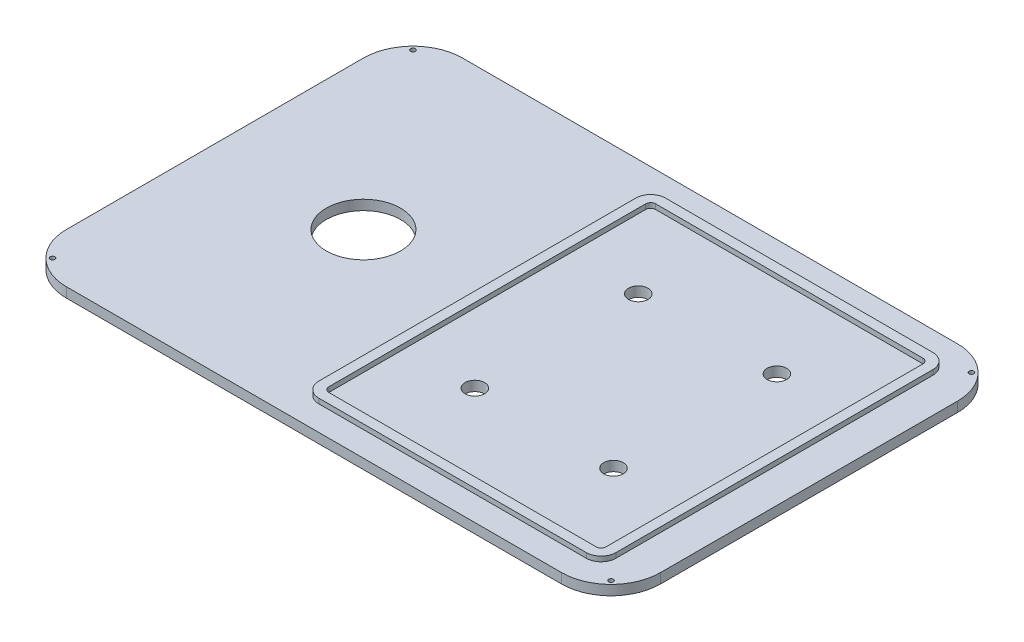
ISO-10303-21;
HEADER;
FILE_DESCRIPTION(('STEP AP214'),'2;1');
FILE_NAME('part.step','',(''),(''),'','','');
FILE_SCHEMA(('AUTOMOTIVE_DESIGN { 1 0 10303 214 1 1 1 1 }'));
ENDSEC;
DATA;
#1=APPLICATION_CONTEXT('core data for automotive mechanical design processes');
#2=APPLICATION_PROTOCOL_DEFINITION('international standard','automotive_design',2000,#1);
#3=PRODUCT_CONTEXT('',#1,'mechanical');
#4=PRODUCT('Part','Part','',(#3));
#5=PRODUCT_RELATED_PRODUCT_CATEGORY('part','',(#4));
#6=PRODUCT_DEFINITION_FORMATION('','',#4);
#7=PRODUCT_DEFINITION_CONTEXT('part definition',#1,'design');
#8=PRODUCT_DEFINITION('design','',#6,#7);
#9=PRODUCT_DEFINITION_SHAPE('','',#8);
#10=(LENGTH_UNIT() NAMED_UNIT(*) SI_UNIT(.MILLI.,.METRE.));
#11=(NAMED_UNIT(*) PLANE_ANGLE_UNIT() SI_UNIT($,.RADIAN.));
#12=(NAMED_UNIT(*) SI_UNIT($,.STERADIAN.) SOLID_ANGLE_UNIT());
#13=UNCERTAINTY_MEASURE_WITH_UNIT(LENGTH_MEASURE(1.E-05),#10,'distance_accuracy_value','');
#14=(GEOMETRIC_REPRESENTATION_CONTEXT(3) GLOBAL_UNCERTAINTY_ASSIGNED_CONTEXT((#13)) GLOBAL_UNIT_ASSIGNED_CONTEXT((#10,
#11,#12)) REPRESENTATION_CONTEXT('',''));
#15=CARTESIAN_POINT('',(0.,0.,0.));
#16=DIRECTION('',(0.,0.,1.));
#17=DIRECTION('',(1.,0.,0.));
#18=AXIS2_PLACEMENT_3D('',#15,#16,#17);
#19=CARTESIAN_POINT('',(63.5,2.54,-38.1));
#20=DIRECTION('',(0.,1.,0.));
#21=DIRECTION('',(0.,0.,1.));
#22=AXIS2_PLACEMENT_3D('',#19,#20,#21);
#23=PLANE('',#22);
#24=CARTESIAN_POINT('',(-38.1,2.54,0.));
#25=DIRECTION('',(0.,1.,0.));
#26=DIRECTION('',(0.,0.,1.));
#27=AXIS2_PLACEMENT_3D('',#24,#25,#26);
#28=CIRCLE('',#27,9.525);
#29=CARTESIAN_POINT('',(-38.1,2.54,9.52500000000001));
#30=VERTEX_POINT('',#29);
#31=EDGE_CURVE('E883',#30,#30,#28,.T.);
#32=ORIENTED_EDGE('',*,*,#31,.F.);
#33=EDGE_LOOP('',(#32));
#34=FACE_BOUND('',#33,.T.);
#35=CARTESIAN_POINT('',(71.628,2.54,-46.228));
#36=DIRECTION('',(0.,1.,0.));
#37=DIRECTION('',(0.,0.,1.));
#38=AXIS2_PLACEMENT_3D('',#35,#36,#37);
#39=CIRCLE('',#38,0.600000000000008);
#40=CARTESIAN_POINT('',(71.628,2.54,-45.628));
#41=VERTEX_POINT('',#40);
#42=EDGE_CURVE('E404',#41,#41,#39,.T.);
#43=ORIENTED_EDGE('',*,*,#42,.F.);
#44=EDGE_LOOP('',(#43));
#45=FACE_BOUND('',#44,.T.);
#46=CARTESIAN_POINT('',(71.628,2.54,46.228));
#47=DIRECTION('',(0.,1.,0.));
#48=DIRECTION('',(0.,0.,1.));
#49=AXIS2_PLACEMENT_3D('',#46,#47,#48);
#50=CIRCLE('',#49,0.600000000000008);
#51=CARTESIAN_POINT('',(71.628,2.54,46.828));
#52=VERTEX_POINT('',#51);
#53=EDGE_CURVE('E396',#52,#52,#50,.T.);
#54=ORIENTED_EDGE('',*,*,#53,.F.);
#55=EDGE_LOOP('',(#54));
#56=FACE_BOUND('',#55,.T.);
#57=CARTESIAN_POINT('',(-71.628,2.54,46.228));
#58=DIRECTION('',(0.,1.,0.));
#59=DIRECTION('',(0.,0.,1.));
#60=AXIS2_PLACEMENT_3D('',#57,#58,#59);
#61=CIRCLE('',#60,0.600000000000008);
#62=CARTESIAN_POINT('',(-71.628,2.54,46.828));
#63=VERTEX_POINT('',#62);
#64=EDGE_CURVE('E387',#63,#63,#61,.T.);
#65=ORIENTED_EDGE('',*,*,#64,.F.);
#66=EDGE_LOOP('',(#65));
#67=FACE_BOUND('',#66,.T.);
#68=CARTESIAN_POINT('',(-71.628,2.54,-46.228));
#69=DIRECTION('',(0.,1.,0.));
#70=DIRECTION('',(0.,0.,1.));
#71=AXIS2_PLACEMENT_3D('',#68,#69,#70);
#72=CIRCLE('',#71,0.600000000000008);
#73=CARTESIAN_POINT('',(-71.628,2.54,-45.628));
#74=VERTEX_POINT('',#73);
#75=EDGE_CURVE('E391',#74,#74,#72,.T.);
#76=ORIENTED_EDGE('',*,*,#75,.F.);
#77=EDGE_LOOP('',(#76));
#78=FACE_BOUND('',#77,.T.);
#79=CARTESIAN_POINT('',(63.5,2.54,-38.1));
#80=DIRECTION('',(0.,1.,0.));
#81=DIRECTION('',(0.,0.,1.));
#82=AXIS2_PLACEMENT_3D('',#79,#80,#81);
#83=CIRCLE('',#82,12.7);
#84=CARTESIAN_POINT('',(76.2,2.54,-38.0999999999999));
#85=VERTEX_POINT('',#84);
#86=CARTESIAN_POINT('',(63.4999999999999,2.54,-50.8));
#87=VERTEX_POINT('',#86);
#88=EDGE_CURVE('E419',#85,#87,#83,.T.);
#89=ORIENTED_EDGE('',*,*,#88,.T.);
#90=DIRECTION('',(-1.,0.,0.));
#91=VECTOR('',#90,1.);
#92=CARTESIAN_POINT('',(63.4999999999999,2.54,-50.8));
#93=LINE('',#92,#91);
#94=CARTESIAN_POINT('',(-63.5,2.54,-50.8));
#95=VERTEX_POINT('',#94);
#96=EDGE_CURVE('E423',#87,#95,#93,.T.);
#97=ORIENTED_EDGE('',*,*,#96,.T.);
#98=CARTESIAN_POINT('',(-63.5,2.54,-38.1));
#99=DIRECTION('',(0.,1.,0.));
#100=DIRECTION('',(0.,0.,-1.));
#101=AXIS2_PLACEMENT_3D('',#98,#99,#100);
#102=CIRCLE('',#101,12.7);
#103=CARTESIAN_POINT('',(-76.2,2.54,-38.0999999999999));
#104=VERTEX_POINT('',#103);
#105=EDGE_CURVE('E427',#95,#104,#102,.T.);
#106=ORIENTED_EDGE('',*,*,#105,.T.);
#107=DIRECTION('',(0.,0.,1.));
#108=VECTOR('',#107,1.);
#109=CARTESIAN_POINT('',(-76.2,2.54,-38.0999999999999));
#110=LINE('',#109,#108);
#111=CARTESIAN_POINT('',(-76.2,2.54,38.0999999999999));
#112=VERTEX_POINT('',#111);
#113=EDGE_CURVE('E430',#104,#112,#110,.T.);
#114=ORIENTED_EDGE('',*,*,#113,.T.);
#115=CARTESIAN_POINT('',(-63.5,2.54,38.1));
#116=DIRECTION('',(0.,1.,0.));
#117=DIRECTION('',(0.,0.,1.));
#118=AXIS2_PLACEMENT_3D('',#115,#116,#117);
#119=CIRCLE('',#118,12.7);
#120=CARTESIAN_POINT('',(-63.4999999999999,2.54,50.8));
#121=VERTEX_POINT('',#120);
#122=EDGE_CURVE('E433',#112,#121,#119,.T.);
#123=ORIENTED_EDGE('',*,*,#122,.T.);
#124=DIRECTION('',(1.,0.,0.));
#125=VECTOR('',#124,1.);
#126=CARTESIAN_POINT('',(63.4999999999999,2.54,50.8));
#127=LINE('',#126,#125);
#128=CARTESIAN_POINT('',(63.4999999999999,2.54,50.8));
#129=VERTEX_POINT('',#128);
#130=EDGE_CURVE('E436',#121,#129,#127,.T.);
#131=ORIENTED_EDGE('',*,*,#130,.T.);
#132=CARTESIAN_POINT('',(63.5,2.54,38.1));
#133=DIRECTION('',(0.,1.,0.));
#134=DIRECTION('',(0.,0.,1.));
#135=AXIS2_PLACEMENT_3D('',#132,#133,#134);
#136=CIRCLE('',#135,12.7);
#137=CARTESIAN_POINT('',(76.2,2.54,38.0999999999999));
#138=VERTEX_POINT('',#137);
#139=EDGE_CURVE('E439',#129,#138,#136,.T.);
#140=ORIENTED_EDGE('',*,*,#139,.T.);
#141=DIRECTION('',(0.,0.,-1.));
#142=VECTOR('',#141,1.);
#143=CARTESIAN_POINT('',(76.2,2.54,-38.0999999999999));
#144=LINE('',#143,#142);
#145=EDGE_CURVE('E442',#138,#85,#144,.T.);
#146=ORIENTED_EDGE('',*,*,#145,.T.);
#147=EDGE_LOOP('',(#89,#97,#106,#114,#123,#131,#140,#146));
#148=FACE_BOUND('',#147,.T.);
#149=DIRECTION('',(1.,0.,0.));
#150=VECTOR('',#149,1.);
#151=CARTESIAN_POINT('',(63.5,2.54,44.45));
#152=LINE('',#151,#150);
#153=CARTESIAN_POINT('',(-5.07999999999996,2.54,44.45));
#154=VERTEX_POINT('',#153);
#155=CARTESIAN_POINT('',(63.5,2.54,44.45));
#156=VERTEX_POINT('',#155);
#157=EDGE_CURVE('E338',#154,#156,#152,.T.);
#158=ORIENTED_EDGE('',*,*,#157,.F.);
#159=CARTESIAN_POINT('',(-5.07999999999999,2.54,40.64));
#160=DIRECTION('',(0.,1.,0.));
#161=DIRECTION('',(0.,0.,-1.));
#162=AXIS2_PLACEMENT_3D('',#159,#160,#161);
#163=CIRCLE('',#162,3.81);
#164=CARTESIAN_POINT('',(-8.88999999999998,2.54,40.64));
#165=VERTEX_POINT('',#164);
#166=EDGE_CURVE('E290',#165,#154,#163,.T.);
#167=ORIENTED_EDGE('',*,*,#166,.F.);
#168=DIRECTION('',(0.,0.,1.));
#169=VECTOR('',#168,1.);
#170=CARTESIAN_POINT('',(-8.89,2.54,-40.64));
#171=LINE('',#170,#169);
#172=CARTESIAN_POINT('',(-8.89,2.54,-40.64));
#173=VERTEX_POINT('',#172);
#174=EDGE_CURVE('E313',#173,#165,#171,.T.);
#175=ORIENTED_EDGE('',*,*,#174,.F.);
#176=CARTESIAN_POINT('',(-5.08,2.54,-40.64));
#177=DIRECTION('',(0.,1.,0.));
#178=DIRECTION('',(0.,0.,-1.));
#179=AXIS2_PLACEMENT_3D('',#176,#177,#178);
#180=CIRCLE('',#179,3.81);
#181=CARTESIAN_POINT('',(-5.07999999999997,2.54,-44.45));
#182=VERTEX_POINT('',#181);
#183=EDGE_CURVE('E353',#182,#173,#180,.T.);
#184=ORIENTED_EDGE('',*,*,#183,.F.);
#185=DIRECTION('',(-1.,0.,0.));
#186=VECTOR('',#185,1.);
#187=CARTESIAN_POINT('',(63.5,2.54,-44.45));
#188=LINE('',#187,#186);
#189=CARTESIAN_POINT('',(63.5,2.54,-44.45));
#190=VERTEX_POINT('',#189);
#191=EDGE_CURVE('E350',#190,#182,#188,.T.);
#192=ORIENTED_EDGE('',*,*,#191,.F.);
#193=CARTESIAN_POINT('',(63.5,2.54,-40.64));
#194=DIRECTION('',(0.,1.,0.));
#195=DIRECTION('',(0.,0.,-1.));
#196=AXIS2_PLACEMENT_3D('',#193,#194,#195);
#197=CIRCLE('',#196,3.81);
#198=CARTESIAN_POINT('',(67.31,2.54,-40.64));
#199=VERTEX_POINT('',#198);
#200=EDGE_CURVE('E347',#199,#190,#197,.T.);
#201=ORIENTED_EDGE('',*,*,#200,.F.);
#202=DIRECTION('',(0.,0.,-1.));
#203=VECTOR('',#202,1.);
#204=CARTESIAN_POINT('',(67.31,2.54,-40.64));
#205=LINE('',#204,#203);
#206=CARTESIAN_POINT('',(67.31,2.54,40.64));
#207=VERTEX_POINT('',#206);
#208=EDGE_CURVE('E344',#207,#199,#205,.T.);
#209=ORIENTED_EDGE('',*,*,#208,.F.);
#210=CARTESIAN_POINT('',(63.5,2.54,40.64));
#211=DIRECTION('',(0.,1.,0.));
#212=DIRECTION('',(0.,0.,-1.));
#213=AXIS2_PLACEMENT_3D('',#210,#211,#212);
#214=CIRCLE('',#213,3.81);
#215=EDGE_CURVE('E341',#156,#207,#214,.T.);
#216=ORIENTED_EDGE('',*,*,#215,.F.);
#217=EDGE_LOOP('',(#158,#167,#175,#184,#192,#201,#209,#216));
#218=FACE_BOUND('',#217,.T.);
#219=ADVANCED_FACE('F45',(#34,#45,#56,#67,#78,#148,#218),#23,.T.);
#220=CARTESIAN_POINT('',(63.5,2.54,-38.1));
#221=DIRECTION('',(0.,-1.,0.));
#222=DIRECTION('',(0.,0.,-1.));
#223=AXIS2_PLACEMENT_3D('',#220,#221,#222);
#224=CYLINDRICAL_SURFACE('',#223,12.7);
#225=CARTESIAN_POINT('',(63.5,0.,-38.1));
#226=DIRECTION('',(0.,1.,0.));
#227=DIRECTION('',(0.,0.,1.));
#228=AXIS2_PLACEMENT_3D('',#225,#226,#227);
#229=CIRCLE('',#228,12.7);
#230=CARTESIAN_POINT('',(76.2,0.,-38.0999999999999));
#231=VERTEX_POINT('',#230);
#232=CARTESIAN_POINT('',(63.4999999999999,0.,-50.8));
#233=VERTEX_POINT('',#232);
#234=EDGE_CURVE('E415',#231,#233,#229,.T.);
#235=ORIENTED_EDGE('',*,*,#234,.T.);
#236=DIRECTION('',(0.,-1.,0.));
#237=VECTOR('',#236,1.);
#238=CARTESIAN_POINT('',(63.4999999999999,2.54,-50.8));
#239=LINE('',#238,#237);
#240=EDGE_CURVE('E11',#87,#233,#239,.T.);
#241=ORIENTED_EDGE('',*,*,#240,.F.);
#242=ORIENTED_EDGE('',*,*,#88,.F.);
#243=DIRECTION('',(0.,-1.,0.));
#244=VECTOR('',#243,1.);
#245=CARTESIAN_POINT('',(76.2,2.54,-38.0999999999999));
#246=LINE('',#245,#244);
#247=EDGE_CURVE('E445',#85,#231,#246,.T.);
#248=ORIENTED_EDGE('',*,*,#247,.T.);
#249=EDGE_LOOP('',(#235,#241,#242,#248));
#250=FACE_BOUND('',#249,.T.);
#251=ADVANCED_FACE('F47',(#250),#224,.T.);
#252=CARTESIAN_POINT('',(63.4999999999999,2.54,-50.8));
#253=DIRECTION('',(0.,0.,1.));
#254=DIRECTION('',(1.,0.,0.));
#255=AXIS2_PLACEMENT_3D('',#252,#253,#254);
#256=PLANE('',#255);
#257=DIRECTION('',(-1.,0.,0.));
#258=VECTOR('',#257,1.);
#259=CARTESIAN_POINT('',(63.4999999999999,0.,-50.8));
#260=LINE('',#259,#258);
#261=CARTESIAN_POINT('',(-63.5,0.,-50.8));
#262=VERTEX_POINT('',#261);
#263=EDGE_CURVE('E449',#233,#262,#260,.T.);
#264=ORIENTED_EDGE('',*,*,#263,.T.);
#265=DIRECTION('',(0.,-1.,0.));
#266=VECTOR('',#265,1.);
#267=CARTESIAN_POINT('',(-63.5,2.54,-50.8));
#268=LINE('',#267,#266);
#269=EDGE_CURVE('E55',#95,#262,#268,.T.);
#270=ORIENTED_EDGE('',*,*,#269,.F.);
#271=ORIENTED_EDGE('',*,*,#96,.F.);
#272=ORIENTED_EDGE('',*,*,#240,.T.);
#273=EDGE_LOOP('',(#264,#270,#271,#272));
#274=FACE_BOUND('',#273,.T.);
#275=ADVANCED_FACE('F521',(#274),#256,.F.);
#276=CARTESIAN_POINT('',(-63.5,2.54,-38.1));
#277=DIRECTION('',(0.,-1.,0.));
#278=DIRECTION('',(0.,0.,-1.));
#279=AXIS2_PLACEMENT_3D('',#276,#277,#278);
#280=CYLINDRICAL_SURFACE('',#279,12.7);
#281=CARTESIAN_POINT('',(-63.5,0.,-38.1));
#282=DIRECTION('',(0.,1.,0.));
#283=DIRECTION('',(0.,0.,-1.));
#284=AXIS2_PLACEMENT_3D('',#281,#282,#283);
#285=CIRCLE('',#284,12.7);
#286=CARTESIAN_POINT('',(-76.2,0.,-38.0999999999999));
#287=VERTEX_POINT('',#286);
#288=EDGE_CURVE('E452',#262,#287,#285,.T.);
#289=ORIENTED_EDGE('',*,*,#288,.T.);
#290=DIRECTION('',(0.,-1.,0.));
#291=VECTOR('',#290,1.);
#292=CARTESIAN_POINT('',(-76.2,2.54,-38.0999999999999));
#293=LINE('',#292,#291);
#294=EDGE_CURVE('E488',#104,#287,#293,.T.);
#295=ORIENTED_EDGE('',*,*,#294,.F.);
#296=ORIENTED_EDGE('',*,*,#105,.F.);
#297=ORIENTED_EDGE('',*,*,#269,.T.);
#298=EDGE_LOOP('',(#289,#295,#296,#297));
#299=FACE_BOUND('',#298,.T.);
#300=ADVANCED_FACE('F498',(#299),#280,.T.);
#301=CARTESIAN_POINT('',(-76.2,2.54,-38.0999999999999));
#302=DIRECTION('',(1.,0.,0.));
#303=DIRECTION('',(0.,0.,-1.));
#304=AXIS2_PLACEMENT_3D('',#301,#302,#303);
#305=PLANE('',#304);
#306=DIRECTION('',(0.,0.,1.));
#307=VECTOR('',#306,1.);
#308=CARTESIAN_POINT('',(-76.2,0.,-38.0999999999999));
#309=LINE('',#308,#307);
#310=CARTESIAN_POINT('',(-76.2,0.,38.0999999999999));
#311=VERTEX_POINT('',#310);
#312=EDGE_CURVE('E455',#287,#311,#309,.T.);
#313=ORIENTED_EDGE('',*,*,#312,.T.);
#314=DIRECTION('',(0.,-1.,0.));
#315=VECTOR('',#314,1.);
#316=CARTESIAN_POINT('',(-76.2,2.54,38.0999999999999));
#317=LINE('',#316,#315);
#318=EDGE_CURVE('E484',#112,#311,#317,.T.);
#319=ORIENTED_EDGE('',*,*,#318,.F.);
#320=ORIENTED_EDGE('',*,*,#113,.F.);
#321=ORIENTED_EDGE('',*,*,#294,.T.);
#322=EDGE_LOOP('',(#313,#319,#320,#321));
#323=FACE_BOUND('',#322,.T.);
#324=ADVANCED_FACE('F509',(#323),#305,.F.);
#325=CARTESIAN_POINT('',(-63.5,2.54,38.1));
#326=DIRECTION('',(0.,-1.,0.));
#327=DIRECTION('',(0.,0.,-1.));
#328=AXIS2_PLACEMENT_3D('',#325,#326,#327);
#329=CYLINDRICAL_SURFACE('',#328,12.7);
#330=CARTESIAN_POINT('',(-63.5,0.,38.1));
#331=DIRECTION('',(0.,1.,0.));
#332=DIRECTION('',(0.,0.,1.));
#333=AXIS2_PLACEMENT_3D('',#330,#331,#332);
#334=CIRCLE('',#333,12.7);
#335=CARTESIAN_POINT('',(-63.4999999999999,0.,50.8));
#336=VERTEX_POINT('',#335);
#337=EDGE_CURVE('E458',#311,#336,#334,.T.);
#338=ORIENTED_EDGE('',*,*,#337,.T.);
#339=DIRECTION('',(0.,-1.,0.));
#340=VECTOR('',#339,1.);
#341=CARTESIAN_POINT('',(-63.4999999999999,2.54,50.8));
#342=LINE('',#341,#340);
#343=EDGE_CURVE('E480',#121,#336,#342,.T.);
#344=ORIENTED_EDGE('',*,*,#343,.F.);
#345=ORIENTED_EDGE('',*,*,#122,.F.);
#346=ORIENTED_EDGE('',*,*,#318,.T.);
#347=EDGE_LOOP('',(#338,#344,#345,#346));
#348=FACE_BOUND('',#347,.T.);
#349=ADVANCED_FACE('F513',(#348),#329,.T.);
#350=CARTESIAN_POINT('',(63.4999999999999,2.54,50.8));
#351=DIRECTION('',(0.,0.,-1.));
#352=DIRECTION('',(-1.,0.,0.));
#353=AXIS2_PLACEMENT_3D('',#350,#351,#352);
#354=PLANE('',#353);
#355=DIRECTION('',(1.,0.,0.));
#356=VECTOR('',#355,1.);
#357=CARTESIAN_POINT('',(63.4999999999999,0.,50.8));
#358=LINE('',#357,#356);
#359=CARTESIAN_POINT('',(63.4999999999999,0.,50.8));
#360=VERTEX_POINT('',#359);
#361=EDGE_CURVE('E461',#336,#360,#358,.T.);
#362=ORIENTED_EDGE('',*,*,#361,.T.);
#363=DIRECTION('',(0.,-1.,0.));
#364=VECTOR('',#363,1.);
#365=CARTESIAN_POINT('',(63.4999999999999,2.54,50.8));
#366=LINE('',#365,#364);
#367=EDGE_CURVE('E476',#129,#360,#366,.T.);
#368=ORIENTED_EDGE('',*,*,#367,.F.);
#369=ORIENTED_EDGE('',*,*,#130,.F.);
#370=ORIENTED_EDGE('',*,*,#343,.T.);
#371=EDGE_LOOP('',(#362,#368,#369,#370));
#372=FACE_BOUND('',#371,.T.);
#373=ADVANCED_FACE('F534',(#372),#354,.F.);
#374=CARTESIAN_POINT('',(63.5,2.54,38.1));
#375=DIRECTION('',(0.,-1.,0.));
#376=DIRECTION('',(0.,0.,-1.));
#377=AXIS2_PLACEMENT_3D('',#374,#375,#376);
#378=CYLINDRICAL_SURFACE('',#377,12.7);
#379=CARTESIAN_POINT('',(63.5,0.,38.1));
#380=DIRECTION('',(0.,1.,0.));
#381=DIRECTION('',(0.,0.,1.));
#382=AXIS2_PLACEMENT_3D('',#379,#380,#381);
#383=CIRCLE('',#382,12.7);
#384=CARTESIAN_POINT('',(76.2,0.,38.0999999999999));
#385=VERTEX_POINT('',#384);
#386=EDGE_CURVE('E464',#360,#385,#383,.T.);
#387=ORIENTED_EDGE('',*,*,#386,.T.);
#388=DIRECTION('',(0.,-1.,0.));
#389=VECTOR('',#388,1.);
#390=CARTESIAN_POINT('',(76.2,2.54,38.0999999999999));
#391=LINE('',#390,#389);
#392=EDGE_CURVE('E472',#138,#385,#391,.T.);
#393=ORIENTED_EDGE('',*,*,#392,.F.);
#394=ORIENTED_EDGE('',*,*,#139,.F.);
#395=ORIENTED_EDGE('',*,*,#367,.T.);
#396=EDGE_LOOP('',(#387,#393,#394,#395));
#397=FACE_BOUND('',#396,.T.);
#398=ADVANCED_FACE('F532',(#397),#378,.T.);
#399=CARTESIAN_POINT('',(76.2,2.54,-38.0999999999999));
#400=DIRECTION('',(-1.,0.,0.));
#401=DIRECTION('',(0.,0.,1.));
#402=AXIS2_PLACEMENT_3D('',#399,#400,#401);
#403=PLANE('',#402);
#404=DIRECTION('',(0.,0.,-1.));
#405=VECTOR('',#404,1.);
#406=CARTESIAN_POINT('',(76.2,0.,-38.0999999999999));
#407=LINE('',#406,#405);
#408=EDGE_CURVE('E424',#385,#231,#407,.T.);
#409=ORIENTED_EDGE('',*,*,#408,.T.);
#410=ORIENTED_EDGE('',*,*,#247,.F.);
#411=ORIENTED_EDGE('',*,*,#145,.F.);
#412=ORIENTED_EDGE('',*,*,#392,.T.);
#413=EDGE_LOOP('',(#409,#410,#411,#412));
#414=FACE_BOUND('',#413,.T.);
#415=ADVANCED_FACE('F527',(#414),#403,.F.);
#416=CARTESIAN_POINT('',(63.5,0.,-38.1));
#417=DIRECTION('',(0.,1.,0.));
#418=DIRECTION('',(0.,0.,1.));
#419=AXIS2_PLACEMENT_3D('',#416,#417,#418);
#420=PLANE('',#419);
#421=CARTESIAN_POINT('',(-38.1,0.,0.));
#422=DIRECTION('',(0.,1.,0.));
#423=DIRECTION('',(0.,0.,1.));
#424=AXIS2_PLACEMENT_3D('',#421,#422,#423);
#425=CIRCLE('',#424,9.525);
#426=CARTESIAN_POINT('',(-38.1,0.,9.52500000000001));
#427=VERTEX_POINT('',#426);
#428=EDGE_CURVE('E49',#427,#427,#425,.T.);
#429=ORIENTED_EDGE('',*,*,#428,.T.);
#430=EDGE_LOOP('',(#429));
#431=FACE_BOUND('',#430,.T.);
#432=CARTESIAN_POINT('',(46.99,0.,-20.955));
#433=DIRECTION('',(0.,1.,0.));
#434=DIRECTION('',(0.,0.,1.));
#435=AXIS2_PLACEMENT_3D('',#432,#433,#434);
#436=CIRCLE('',#435,2.499995);
#437=CARTESIAN_POINT('',(46.99,0.,-18.455005));
#438=VERTEX_POINT('',#437);
#439=EDGE_CURVE('E903',#438,#438,#436,.T.);
#440=ORIENTED_EDGE('',*,*,#439,.T.);
#441=EDGE_LOOP('',(#440));
#442=FACE_BOUND('',#441,.T.);
#443=CARTESIAN_POINT('',(11.43,0.,20.955));
#444=DIRECTION('',(0.,1.,0.));
#445=DIRECTION('',(0.,0.,1.));
#446=AXIS2_PLACEMENT_3D('',#443,#444,#445);
#447=CIRCLE('',#446,2.499995);
#448=CARTESIAN_POINT('',(11.43,0.,23.454995));
#449=VERTEX_POINT('',#448);
#450=EDGE_CURVE('E897',#449,#449,#447,.T.);
#451=ORIENTED_EDGE('',*,*,#450,.T.);
#452=EDGE_LOOP('',(#451));
#453=FACE_BOUND('',#452,.T.);
#454=CARTESIAN_POINT('',(46.99,0.,20.955));
#455=DIRECTION('',(0.,1.,0.));
#456=DIRECTION('',(0.,0.,1.));
#457=AXIS2_PLACEMENT_3D('',#454,#455,#456);
#458=CIRCLE('',#457,2.499995);
#459=CARTESIAN_POINT('',(46.99,0.,23.454995));
#460=VERTEX_POINT('',#459);
#461=EDGE_CURVE('E887',#460,#460,#458,.T.);
#462=ORIENTED_EDGE('',*,*,#461,.T.);
#463=EDGE_LOOP('',(#462));
#464=FACE_BOUND('',#463,.T.);
#465=CARTESIAN_POINT('',(11.43,0.,-20.955));
#466=DIRECTION('',(0.,1.,0.));
#467=DIRECTION('',(0.,0.,1.));
#468=AXIS2_PLACEMENT_3D('',#465,#466,#467);
#469=CIRCLE('',#468,2.499995);
#470=CARTESIAN_POINT('',(11.43,0.,-18.455005));
#471=VERTEX_POINT('',#470);
#472=EDGE_CURVE('E265',#471,#471,#469,.T.);
#473=ORIENTED_EDGE('',*,*,#472,.T.);
#474=EDGE_LOOP('',(#473));
#475=FACE_BOUND('',#474,.T.);
#476=CARTESIAN_POINT('',(71.628,0.,-46.228));
#477=DIRECTION('',(0.,1.,0.));
#478=DIRECTION('',(0.,0.,1.));
#479=AXIS2_PLACEMENT_3D('',#476,#477,#478);
#480=CIRCLE('',#479,0.600000000000008);
#481=CARTESIAN_POINT('',(71.628,0.,-45.628));
#482=VERTEX_POINT('',#481);
#483=EDGE_CURVE('E386',#482,#482,#480,.T.);
#484=ORIENTED_EDGE('',*,*,#483,.T.);
#485=EDGE_LOOP('',(#484));
#486=FACE_BOUND('',#485,.T.);
#487=CARTESIAN_POINT('',(71.628,0.,46.228));
#488=DIRECTION('',(0.,1.,0.));
#489=DIRECTION('',(0.,0.,1.));
#490=AXIS2_PLACEMENT_3D('',#487,#488,#489);
#491=CIRCLE('',#490,0.600000000000008);
#492=CARTESIAN_POINT('',(71.628,0.,46.828));
#493=VERTEX_POINT('',#492);
#494=EDGE_CURVE('E400',#493,#493,#491,.T.);
#495=ORIENTED_EDGE('',*,*,#494,.T.);
#496=EDGE_LOOP('',(#495));
#497=FACE_BOUND('',#496,.T.);
#498=CARTESIAN_POINT('',(-71.628,0.,46.228));
#499=DIRECTION('',(0.,1.,0.));
#500=DIRECTION('',(0.,0.,1.));
#501=AXIS2_PLACEMENT_3D('',#498,#499,#500);
#502=CIRCLE('',#501,0.600000000000008);
#503=CARTESIAN_POINT('',(-71.628,0.,46.828));
#504=VERTEX_POINT('',#503);
#505=EDGE_CURVE('E392',#504,#504,#502,.T.);
#506=ORIENTED_EDGE('',*,*,#505,.T.);
#507=EDGE_LOOP('',(#506));
#508=FACE_BOUND('',#507,.T.);
#509=CARTESIAN_POINT('',(-71.628,0.,-46.228));
#510=DIRECTION('',(0.,1.,0.));
#511=DIRECTION('',(0.,0.,1.));
#512=AXIS2_PLACEMENT_3D('',#509,#510,#511);
#513=CIRCLE('',#512,0.600000000000008);
#514=CARTESIAN_POINT('',(-71.628,0.,-45.628));
#515=VERTEX_POINT('',#514);
#516=EDGE_CURVE('E411',#515,#515,#513,.T.);
#517=ORIENTED_EDGE('',*,*,#516,.T.);
#518=EDGE_LOOP('',(#517));
#519=FACE_BOUND('',#518,.T.);
#520=ORIENTED_EDGE('',*,*,#234,.F.);
#521=ORIENTED_EDGE('',*,*,#408,.F.);
#522=ORIENTED_EDGE('',*,*,#386,.F.);
#523=ORIENTED_EDGE('',*,*,#361,.F.);
#524=ORIENTED_EDGE('',*,*,#337,.F.);
#525=ORIENTED_EDGE('',*,*,#312,.F.);
#526=ORIENTED_EDGE('',*,*,#288,.F.);
#527=ORIENTED_EDGE('',*,*,#263,.F.);
#528=EDGE_LOOP('',(#520,#521,#522,#523,#524,#525,#526,#527));
#529=FACE_BOUND('',#528,.T.);
#530=ADVANCED_FACE('F504',(#431,#442,#453,#464,#475,#486,#497,#508,#519,#529),#420,.F.);
#531=CARTESIAN_POINT('',(-71.628,0.,-46.228));
#532=DIRECTION('',(0.,1.,0.));
#533=DIRECTION('',(0.,0.,1.));
#534=AXIS2_PLACEMENT_3D('',#531,#532,#533);
#535=CYLINDRICAL_SURFACE('',#534,0.600000000000008);
#536=ORIENTED_EDGE('',*,*,#516,.F.);
#537=EDGE_LOOP('',(#536));
#538=FACE_BOUND('',#537,.T.);
#539=ORIENTED_EDGE('',*,*,#75,.T.);
#540=EDGE_LOOP('',(#539));
#541=FACE_BOUND('',#540,.T.);
#542=ADVANCED_FACE('F555',(#538,#541),#535,.F.);
#543=CARTESIAN_POINT('',(-71.628,0.,46.228));
#544=DIRECTION('',(0.,1.,0.));
#545=DIRECTION('',(0.,0.,1.));
#546=AXIS2_PLACEMENT_3D('',#543,#544,#545);
#547=CYLINDRICAL_SURFACE('',#546,0.600000000000008);
#548=ORIENTED_EDGE('',*,*,#505,.F.);
#549=EDGE_LOOP('',(#548));
#550=FACE_BOUND('',#549,.T.);
#551=ORIENTED_EDGE('',*,*,#64,.T.);
#552=EDGE_LOOP('',(#551));
#553=FACE_BOUND('',#552,.T.);
#554=ADVANCED_FACE('F572',(#550,#553),#547,.F.);
#555=CARTESIAN_POINT('',(71.628,0.,46.228));
#556=DIRECTION('',(0.,1.,0.));
#557=DIRECTION('',(0.,0.,1.));
#558=AXIS2_PLACEMENT_3D('',#555,#556,#557);
#559=CYLINDRICAL_SURFACE('',#558,0.600000000000008);
#560=ORIENTED_EDGE('',*,*,#494,.F.);
#561=EDGE_LOOP('',(#560));
#562=FACE_BOUND('',#561,.T.);
#563=ORIENTED_EDGE('',*,*,#53,.T.);
#564=EDGE_LOOP('',(#563));
#565=FACE_BOUND('',#564,.T.);
#566=ADVANCED_FACE('F580',(#562,#565),#559,.F.);
#567=CARTESIAN_POINT('',(71.628,0.,-46.228));
#568=DIRECTION('',(0.,1.,0.));
#569=DIRECTION('',(0.,0.,1.));
#570=AXIS2_PLACEMENT_3D('',#567,#568,#569);
#571=CYLINDRICAL_SURFACE('',#570,0.600000000000008);
#572=ORIENTED_EDGE('',*,*,#483,.F.);
#573=EDGE_LOOP('',(#572));
#574=FACE_BOUND('',#573,.T.);
#575=ORIENTED_EDGE('',*,*,#42,.T.);
#576=EDGE_LOOP('',(#575));
#577=FACE_BOUND('',#576,.T.);
#578=ADVANCED_FACE('F589',(#574,#577),#571,.F.);
#579=CARTESIAN_POINT('',(-5.07999999999999,3.81,40.64));
#580=DIRECTION('',(0.,-1.,0.));
#581=DIRECTION('',(0.,0.,-1.));
#582=AXIS2_PLACEMENT_3D('',#579,#580,#581);
#583=CYLINDRICAL_SURFACE('',#582,3.81);
#584=ORIENTED_EDGE('',*,*,#166,.T.);
#585=DIRECTION('',(0.,-1.,0.));
#586=VECTOR('',#585,1.);
#587=CARTESIAN_POINT('',(-5.07999999999996,3.81,44.45));
#588=LINE('',#587,#586);
#589=CARTESIAN_POINT('',(-5.07999999999996,3.81,44.45));
#590=VERTEX_POINT('',#589);
#591=EDGE_CURVE('E383',#590,#154,#588,.T.);
#592=ORIENTED_EDGE('',*,*,#591,.F.);
#593=CARTESIAN_POINT('',(-5.07999999999999,3.81,40.64));
#594=DIRECTION('',(0.,1.,0.));
#595=DIRECTION('',(0.,0.,-1.));
#596=AXIS2_PLACEMENT_3D('',#593,#594,#595);
#597=CIRCLE('',#596,3.81);
#598=CARTESIAN_POINT('',(-8.88999999999998,3.81,40.64));
#599=VERTEX_POINT('',#598);
#600=EDGE_CURVE('E308',#599,#590,#597,.T.);
#601=ORIENTED_EDGE('',*,*,#600,.F.);
#602=DIRECTION('',(0.,-1.,0.));
#603=VECTOR('',#602,1.);
#604=CARTESIAN_POINT('',(-8.88999999999998,3.81,40.64));
#605=LINE('',#604,#603);
#606=EDGE_CURVE('E334',#599,#165,#605,.T.);
#607=ORIENTED_EDGE('',*,*,#606,.T.);
#608=EDGE_LOOP('',(#584,#592,#601,#607));
#609=FACE_BOUND('',#608,.T.);
#610=ADVANCED_FACE('F598',(#609),#583,.T.);
#611=CARTESIAN_POINT('',(63.5,3.81,44.45));
#612=DIRECTION('',(0.,0.,-1.));
#613=DIRECTION('',(-1.,0.,0.));
#614=AXIS2_PLACEMENT_3D('',#611,#612,#613);
#615=PLANE('',#614);
#616=ORIENTED_EDGE('',*,*,#157,.T.);
#617=DIRECTION('',(0.,-1.,0.));
#618=VECTOR('',#617,1.);
#619=CARTESIAN_POINT('',(63.5,3.81,44.45));
#620=LINE('',#619,#618);
#621=CARTESIAN_POINT('',(63.5,3.81,44.45));
#622=VERTEX_POINT('',#621);
#623=EDGE_CURVE('E379',#622,#156,#620,.T.);
#624=ORIENTED_EDGE('',*,*,#623,.F.);
#625=DIRECTION('',(1.,0.,0.));
#626=VECTOR('',#625,1.);
#627=CARTESIAN_POINT('',(63.5,3.81,44.45));
#628=LINE('',#627,#626);
#629=EDGE_CURVE('E312',#590,#622,#628,.T.);
#630=ORIENTED_EDGE('',*,*,#629,.F.);
#631=ORIENTED_EDGE('',*,*,#591,.T.);
#632=EDGE_LOOP('',(#616,#624,#630,#631));
#633=FACE_BOUND('',#632,.T.);
#634=ADVANCED_FACE('F607',(#633),#615,.F.);
#635=CARTESIAN_POINT('',(63.5,3.81,40.64));
#636=DIRECTION('',(0.,-1.,0.));
#637=DIRECTION('',(0.,0.,-1.));
#638=AXIS2_PLACEMENT_3D('',#635,#636,#637);
#639=CYLINDRICAL_SURFACE('',#638,3.81);
#640=ORIENTED_EDGE('',*,*,#215,.T.);
#641=DIRECTION('',(0.,-1.,0.));
#642=VECTOR('',#641,1.);
#643=CARTESIAN_POINT('',(67.31,3.81,40.64));
#644=LINE('',#643,#642);
#645=CARTESIAN_POINT('',(67.31,3.81,40.64));
#646=VERTEX_POINT('',#645);
#647=EDGE_CURVE('E375',#646,#207,#644,.T.);
#648=ORIENTED_EDGE('',*,*,#647,.F.);
#649=CARTESIAN_POINT('',(63.5,3.81,40.64));
#650=DIRECTION('',(0.,1.,0.));
#651=DIRECTION('',(0.,0.,-1.));
#652=AXIS2_PLACEMENT_3D('',#649,#650,#651);
#653=CIRCLE('',#652,3.81);
#654=EDGE_CURVE('E316',#622,#646,#653,.T.);
#655=ORIENTED_EDGE('',*,*,#654,.F.);
#656=ORIENTED_EDGE('',*,*,#623,.T.);
#657=EDGE_LOOP('',(#640,#648,#655,#656));
#658=FACE_BOUND('',#657,.T.);
#659=ADVANCED_FACE('F616',(#658),#639,.T.);
#660=CARTESIAN_POINT('',(67.31,3.81,-40.64));
#661=DIRECTION('',(-1.,0.,0.));
#662=DIRECTION('',(0.,0.,1.));
#663=AXIS2_PLACEMENT_3D('',#660,#661,#662);
#664=PLANE('',#663);
#665=ORIENTED_EDGE('',*,*,#208,.T.);
#666=DIRECTION('',(0.,-1.,0.));
#667=VECTOR('',#666,1.);
#668=CARTESIAN_POINT('',(67.31,3.81,-40.64));
#669=LINE('',#668,#667);
#670=CARTESIAN_POINT('',(67.31,3.81,-40.64));
#671=VERTEX_POINT('',#670);
#672=EDGE_CURVE('E371',#671,#199,#669,.T.);
#673=ORIENTED_EDGE('',*,*,#672,.F.);
#674=DIRECTION('',(0.,0.,-1.));
#675=VECTOR('',#674,1.);
#676=CARTESIAN_POINT('',(67.31,3.81,-40.64));
#677=LINE('',#676,#675);
#678=EDGE_CURVE('E319',#646,#671,#677,.T.);
#679=ORIENTED_EDGE('',*,*,#678,.F.);
#680=ORIENTED_EDGE('',*,*,#647,.T.);
#681=EDGE_LOOP('',(#665,#673,#679,#680));
#682=FACE_BOUND('',#681,.T.);
#683=ADVANCED_FACE('F625',(#682),#664,.F.);
#684=CARTESIAN_POINT('',(63.5,3.81,-40.64));
#685=DIRECTION('',(0.,-1.,0.));
#686=DIRECTION('',(0.,0.,-1.));
#687=AXIS2_PLACEMENT_3D('',#684,#685,#686);
#688=CYLINDRICAL_SURFACE('',#687,3.81);
#689=ORIENTED_EDGE('',*,*,#200,.T.);
#690=DIRECTION('',(0.,-1.,0.));
#691=VECTOR('',#690,1.);
#692=CARTESIAN_POINT('',(63.5,3.81,-44.45));
#693=LINE('',#692,#691);
#694=CARTESIAN_POINT('',(63.5,3.81,-44.45));
#695=VERTEX_POINT('',#694);
#696=EDGE_CURVE('E367',#695,#190,#693,.T.);
#697=ORIENTED_EDGE('',*,*,#696,.F.);
#698=CARTESIAN_POINT('',(63.5,3.81,-40.64));
#699=DIRECTION('',(0.,1.,0.));
#700=DIRECTION('',(0.,0.,-1.));
#701=AXIS2_PLACEMENT_3D('',#698,#699,#700);
#702=CIRCLE('',#701,3.81);
#703=EDGE_CURVE('E322',#671,#695,#702,.T.);
#704=ORIENTED_EDGE('',*,*,#703,.F.);
#705=ORIENTED_EDGE('',*,*,#672,.T.);
#706=EDGE_LOOP('',(#689,#697,#704,#705));
#707=FACE_BOUND('',#706,.T.);
#708=ADVANCED_FACE('F634',(#707),#688,.T.);
#709=CARTESIAN_POINT('',(63.5,3.81,-44.45));
#710=DIRECTION('',(0.,0.,1.));
#711=DIRECTION('',(1.,0.,0.));
#712=AXIS2_PLACEMENT_3D('',#709,#710,#711);
#713=PLANE('',#712);
#714=ORIENTED_EDGE('',*,*,#191,.T.);
#715=DIRECTION('',(0.,-1.,0.));
#716=VECTOR('',#715,1.);
#717=CARTESIAN_POINT('',(-5.07999999999997,3.81,-44.45));
#718=LINE('',#717,#716);
#719=CARTESIAN_POINT('',(-5.07999999999997,3.81,-44.45));
#720=VERTEX_POINT('',#719);
#721=EDGE_CURVE('E363',#720,#182,#718,.T.);
#722=ORIENTED_EDGE('',*,*,#721,.F.);
#723=DIRECTION('',(-1.,0.,0.));
#724=VECTOR('',#723,1.);
#725=CARTESIAN_POINT('',(63.5,3.81,-44.45));
#726=LINE('',#725,#724);
#727=EDGE_CURVE('E325',#695,#720,#726,.T.);
#728=ORIENTED_EDGE('',*,*,#727,.F.);
#729=ORIENTED_EDGE('',*,*,#696,.T.);
#730=EDGE_LOOP('',(#714,#722,#728,#729));
#731=FACE_BOUND('',#730,.T.);
#732=ADVANCED_FACE('F643',(#731),#713,.F.);
#733=CARTESIAN_POINT('',(-5.08,3.81,-40.64));
#734=DIRECTION('',(0.,-1.,0.));
#735=DIRECTION('',(0.,0.,-1.));
#736=AXIS2_PLACEMENT_3D('',#733,#734,#735);
#737=CYLINDRICAL_SURFACE('',#736,3.81);
#738=ORIENTED_EDGE('',*,*,#183,.T.);
#739=DIRECTION('',(0.,-1.,0.));
#740=VECTOR('',#739,1.);
#741=CARTESIAN_POINT('',(-8.89,3.81,-40.64));
#742=LINE('',#741,#740);
#743=CARTESIAN_POINT('',(-8.89,3.81,-40.64));
#744=VERTEX_POINT('',#743);
#745=EDGE_CURVE('E70',#744,#173,#742,.T.);
#746=ORIENTED_EDGE('',*,*,#745,.F.);
#747=CARTESIAN_POINT('',(-5.08,3.81,-40.64));
#748=DIRECTION('',(0.,1.,0.));
#749=DIRECTION('',(0.,0.,-1.));
#750=AXIS2_PLACEMENT_3D('',#747,#748,#749);
#751=CIRCLE('',#750,3.81);
#752=EDGE_CURVE('E328',#720,#744,#751,.T.);
#753=ORIENTED_EDGE('',*,*,#752,.F.);
#754=ORIENTED_EDGE('',*,*,#721,.T.);
#755=EDGE_LOOP('',(#738,#746,#753,#754));
#756=FACE_BOUND('',#755,.T.);
#757=ADVANCED_FACE('F652',(#756),#737,.T.);
#758=CARTESIAN_POINT('',(-8.89,3.81,-40.64));
#759=DIRECTION('',(1.,0.,0.));
#760=DIRECTION('',(0.,0.,-1.));
#761=AXIS2_PLACEMENT_3D('',#758,#759,#760);
#762=PLANE('',#761);
#763=ORIENTED_EDGE('',*,*,#174,.T.);
#764=ORIENTED_EDGE('',*,*,#606,.F.);
#765=DIRECTION('',(0.,0.,1.));
#766=VECTOR('',#765,1.);
#767=CARTESIAN_POINT('',(-8.89,3.81,-40.64));
#768=LINE('',#767,#766);
#769=EDGE_CURVE('E331',#744,#599,#768,.T.);
#770=ORIENTED_EDGE('',*,*,#769,.F.);
#771=ORIENTED_EDGE('',*,*,#745,.T.);
#772=EDGE_LOOP('',(#763,#764,#770,#771));
#773=FACE_BOUND('',#772,.T.);
#774=ADVANCED_FACE('F661',(#773),#762,.F.);
#775=CARTESIAN_POINT('',(-5.07999999999999,3.81,40.64));
#776=DIRECTION('',(0.,-1.,0.));
#777=DIRECTION('',(0.,0.,-1.));
#778=AXIS2_PLACEMENT_3D('',#775,#776,#777);
#779=PLANE('',#778);
#780=DIRECTION('',(1.,0.,0.));
#781=VECTOR('',#780,1.);
#782=CARTESIAN_POINT('',(-5.07999999999998,3.81,41.91));
#783=LINE('',#782,#781);
#784=CARTESIAN_POINT('',(-5.07999999999998,3.81,41.91));
#785=VERTEX_POINT('',#784);
#786=CARTESIAN_POINT('',(63.5,3.81,41.91));
#787=VERTEX_POINT('',#786);
#788=EDGE_CURVE('E264',#785,#787,#783,.T.);
#789=ORIENTED_EDGE('',*,*,#788,.F.);
#790=CARTESIAN_POINT('',(-5.07999999999998,3.81,40.64));
#791=DIRECTION('',(0.,1.,0.));
#792=DIRECTION('',(0.,0.,1.));
#793=AXIS2_PLACEMENT_3D('',#790,#791,#792);
#794=CIRCLE('',#793,1.27);
#795=CARTESIAN_POINT('',(-6.34999999999998,3.81,40.64));
#796=VERTEX_POINT('',#795);
#797=EDGE_CURVE('E62',#796,#785,#794,.T.);
#798=ORIENTED_EDGE('',*,*,#797,.F.);
#799=DIRECTION('',(0.,0.,1.));
#800=VECTOR('',#799,1.);
#801=CARTESIAN_POINT('',(-6.34999999999999,3.81,-40.64));
#802=LINE('',#801,#800);
#803=CARTESIAN_POINT('',(-6.34999999999999,3.81,-40.64));
#804=VERTEX_POINT('',#803);
#805=EDGE_CURVE('E233',#804,#796,#802,.T.);
#806=ORIENTED_EDGE('',*,*,#805,.F.);
#807=CARTESIAN_POINT('',(-5.07999999999999,3.81,-40.64));
#808=DIRECTION('',(0.,1.,0.));
#809=DIRECTION('',(0.,0.,1.));
#810=AXIS2_PLACEMENT_3D('',#807,#808,#809);
#811=CIRCLE('',#810,1.27);
#812=CARTESIAN_POINT('',(-5.07999999999999,3.81,-41.91));
#813=VERTEX_POINT('',#812);
#814=EDGE_CURVE('E237',#813,#804,#811,.T.);
#815=ORIENTED_EDGE('',*,*,#814,.F.);
#816=DIRECTION('',(-1.,0.,0.));
#817=VECTOR('',#816,1.);
#818=CARTESIAN_POINT('',(-5.07999999999999,3.81,-41.91));
#819=LINE('',#818,#817);
#820=CARTESIAN_POINT('',(63.5,3.81,-41.91));
#821=VERTEX_POINT('',#820);
#822=EDGE_CURVE('E280',#821,#813,#819,.T.);
#823=ORIENTED_EDGE('',*,*,#822,.F.);
#824=CARTESIAN_POINT('',(63.5,3.81,-40.64));
#825=DIRECTION('',(0.,1.,0.));
#826=DIRECTION('',(0.,0.,1.));
#827=AXIS2_PLACEMENT_3D('',#824,#825,#826);
#828=CIRCLE('',#827,1.27);
#829=CARTESIAN_POINT('',(64.77,3.81,-40.64));
#830=VERTEX_POINT('',#829);
#831=EDGE_CURVE('E276',#830,#821,#828,.T.);
#832=ORIENTED_EDGE('',*,*,#831,.F.);
#833=DIRECTION('',(0.,0.,-1.));
#834=VECTOR('',#833,1.);
#835=CARTESIAN_POINT('',(64.77,3.81,-40.64));
#836=LINE('',#835,#834);
#837=CARTESIAN_POINT('',(64.77,3.81,40.64));
#838=VERTEX_POINT('',#837);
#839=EDGE_CURVE('E272',#838,#830,#836,.T.);
#840=ORIENTED_EDGE('',*,*,#839,.F.);
#841=CARTESIAN_POINT('',(63.5,3.81,40.64));
#842=DIRECTION('',(0.,1.,0.));
#843=DIRECTION('',(0.,0.,-1.));
#844=AXIS2_PLACEMENT_3D('',#841,#842,#843);
#845=CIRCLE('',#844,1.27);
#846=EDGE_CURVE('E268',#787,#838,#845,.T.);
#847=ORIENTED_EDGE('',*,*,#846,.F.);
#848=EDGE_LOOP('',(#789,#798,#806,#815,#823,#832,#840,#847));
#849=FACE_BOUND('',#848,.T.);
#850=ORIENTED_EDGE('',*,*,#600,.T.);
#851=ORIENTED_EDGE('',*,*,#629,.T.);
#852=ORIENTED_EDGE('',*,*,#654,.T.);
#853=ORIENTED_EDGE('',*,*,#678,.T.);
#854=ORIENTED_EDGE('',*,*,#703,.T.);
#855=ORIENTED_EDGE('',*,*,#727,.T.);
#856=ORIENTED_EDGE('',*,*,#752,.T.);
#857=ORIENTED_EDGE('',*,*,#769,.T.);
#858=EDGE_LOOP('',(#850,#851,#852,#853,#854,#855,#856,#857));
#859=FACE_BOUND('',#858,.T.);
#860=ADVANCED_FACE('F670',(#849,#859),#779,.F.);
#861=CARTESIAN_POINT('',(-5.07999999999998,2.54,40.64));
#862=DIRECTION('',(0.,1.,0.));
#863=DIRECTION('',(0.,0.,1.));
#864=AXIS2_PLACEMENT_3D('',#861,#862,#863);
#865=CYLINDRICAL_SURFACE('',#864,1.27);
#866=ORIENTED_EDGE('',*,*,#797,.T.);
#867=DIRECTION('',(0.,1.,0.));
#868=VECTOR('',#867,1.);
#869=CARTESIAN_POINT('',(-5.07999999999998,2.54,41.91));
#870=LINE('',#869,#868);
#871=CARTESIAN_POINT('',(-5.07999999999998,2.54,41.91));
#872=VERTEX_POINT('',#871);
#873=EDGE_CURVE('E207',#872,#785,#870,.T.);
#874=ORIENTED_EDGE('',*,*,#873,.F.);
#875=CARTESIAN_POINT('',(-5.07999999999998,2.54,40.64));
#876=DIRECTION('',(0.,1.,0.));
#877=DIRECTION('',(0.,0.,1.));
#878=AXIS2_PLACEMENT_3D('',#875,#876,#877);
#879=CIRCLE('',#878,1.27);
#880=CARTESIAN_POINT('',(-6.34999999999998,2.54,40.64));
#881=VERTEX_POINT('',#880);
#882=EDGE_CURVE('E211',#881,#872,#879,.T.);
#883=ORIENTED_EDGE('',*,*,#882,.F.);
#884=DIRECTION('',(0.,1.,0.));
#885=VECTOR('',#884,1.);
#886=CARTESIAN_POINT('',(-6.34999999999998,2.54,40.64));
#887=LINE('',#886,#885);
#888=EDGE_CURVE('E287',#881,#796,#887,.T.);
#889=ORIENTED_EDGE('',*,*,#888,.T.);
#890=EDGE_LOOP('',(#866,#874,#883,#889));
#891=FACE_BOUND('',#890,.T.);
#892=ADVANCED_FACE('F209',(#891),#865,.F.);
#893=CARTESIAN_POINT('',(-6.34999999999999,2.54,-40.64));
#894=DIRECTION('',(-1.,0.,0.));
#895=DIRECTION('',(0.,0.,1.));
#896=AXIS2_PLACEMENT_3D('',#893,#894,#895);
#897=PLANE('',#896);
#898=ORIENTED_EDGE('',*,*,#805,.T.);
#899=ORIENTED_EDGE('',*,*,#888,.F.);
#900=DIRECTION('',(0.,0.,1.));
#901=VECTOR('',#900,1.);
#902=CARTESIAN_POINT('',(-6.34999999999999,2.54,-40.64));
#903=LINE('',#902,#901);
#904=CARTESIAN_POINT('',(-6.34999999999999,2.54,-40.64));
#905=VERTEX_POINT('',#904);
#906=EDGE_CURVE('E218',#905,#881,#903,.T.);
#907=ORIENTED_EDGE('',*,*,#906,.F.);
#908=DIRECTION('',(0.,1.,0.));
#909=VECTOR('',#908,1.);
#910=CARTESIAN_POINT('',(-6.34999999999999,2.54,-40.64));
#911=LINE('',#910,#909);
#912=EDGE_CURVE('E291',#905,#804,#911,.T.);
#913=ORIENTED_EDGE('',*,*,#912,.T.);
#914=EDGE_LOOP('',(#898,#899,#907,#913));
#915=FACE_BOUND('',#914,.T.);
#916=ADVANCED_FACE('F686',(#915),#897,.F.);
#917=CARTESIAN_POINT('',(-5.07999999999999,2.54,-40.64));
#918=DIRECTION('',(0.,1.,0.));
#919=DIRECTION('',(0.,0.,1.));
#920=AXIS2_PLACEMENT_3D('',#917,#918,#919);
#921=CYLINDRICAL_SURFACE('',#920,1.27);
#922=ORIENTED_EDGE('',*,*,#814,.T.);
#923=ORIENTED_EDGE('',*,*,#912,.F.);
#924=CARTESIAN_POINT('',(-5.07999999999999,2.54,-40.64));
#925=DIRECTION('',(0.,1.,0.));
#926=DIRECTION('',(0.,0.,1.));
#927=AXIS2_PLACEMENT_3D('',#924,#925,#926);
#928=CIRCLE('',#927,1.27);
#929=CARTESIAN_POINT('',(-5.07999999999999,2.54,-41.91));
#930=VERTEX_POINT('',#929);
#931=EDGE_CURVE('E257',#930,#905,#928,.T.);
#932=ORIENTED_EDGE('',*,*,#931,.F.);
#933=DIRECTION('',(0.,1.,0.));
#934=VECTOR('',#933,1.);
#935=CARTESIAN_POINT('',(-5.07999999999999,2.54,-41.91));
#936=LINE('',#935,#934);
#937=EDGE_CURVE('E294',#930,#813,#936,.T.);
#938=ORIENTED_EDGE('',*,*,#937,.T.);
#939=EDGE_LOOP('',(#922,#923,#932,#938));
#940=FACE_BOUND('',#939,.T.);
#941=ADVANCED_FACE('F694',(#940),#921,.F.);
#942=CARTESIAN_POINT('',(-5.07999999999999,2.54,-41.91));
#943=DIRECTION('',(0.,0.,-1.));
#944=DIRECTION('',(-1.,0.,0.));
#945=AXIS2_PLACEMENT_3D('',#942,#943,#944);
#946=PLANE('',#945);
#947=ORIENTED_EDGE('',*,*,#822,.T.);
#948=ORIENTED_EDGE('',*,*,#937,.F.);
#949=DIRECTION('',(-1.,0.,0.));
#950=VECTOR('',#949,1.);
#951=CARTESIAN_POINT('',(-5.07999999999999,2.54,-41.91));
#952=LINE('',#951,#950);
#953=CARTESIAN_POINT('',(63.5,2.54,-41.91));
#954=VERTEX_POINT('',#953);
#955=EDGE_CURVE('E253',#954,#930,#952,.T.);
#956=ORIENTED_EDGE('',*,*,#955,.F.);
#957=DIRECTION('',(0.,1.,0.));
#958=VECTOR('',#957,1.);
#959=CARTESIAN_POINT('',(63.5,2.54,-41.91));
#960=LINE('',#959,#958);
#961=EDGE_CURVE('E297',#954,#821,#960,.T.);
#962=ORIENTED_EDGE('',*,*,#961,.T.);
#963=EDGE_LOOP('',(#947,#948,#956,#962));
#964=FACE_BOUND('',#963,.T.);
#965=ADVANCED_FACE('F703',(#964),#946,.F.);
#966=CARTESIAN_POINT('',(63.5,2.54,-40.64));
#967=DIRECTION('',(0.,1.,0.));
#968=DIRECTION('',(0.,0.,1.));
#969=AXIS2_PLACEMENT_3D('',#966,#967,#968);
#970=CYLINDRICAL_SURFACE('',#969,1.27);
#971=ORIENTED_EDGE('',*,*,#831,.T.);
#972=ORIENTED_EDGE('',*,*,#961,.F.);
#973=CARTESIAN_POINT('',(63.5,2.54,-40.64));
#974=DIRECTION('',(0.,1.,0.));
#975=DIRECTION('',(0.,0.,1.));
#976=AXIS2_PLACEMENT_3D('',#973,#974,#975);
#977=CIRCLE('',#976,1.27);
#978=CARTESIAN_POINT('',(64.77,2.54,-40.64));
#979=VERTEX_POINT('',#978);
#980=EDGE_CURVE('E249',#979,#954,#977,.T.);
#981=ORIENTED_EDGE('',*,*,#980,.F.);
#982=DIRECTION('',(0.,1.,0.));
#983=VECTOR('',#982,1.);
#984=CARTESIAN_POINT('',(64.77,2.54,-40.64));
#985=LINE('',#984,#983);
#986=EDGE_CURVE('E300',#979,#830,#985,.T.);
#987=ORIENTED_EDGE('',*,*,#986,.T.);
#988=EDGE_LOOP('',(#971,#972,#981,#987));
#989=FACE_BOUND('',#988,.T.);
#990=ADVANCED_FACE('F712',(#989),#970,.F.);
#991=CARTESIAN_POINT('',(64.77,2.54,-40.64));
#992=DIRECTION('',(1.,0.,0.));
#993=DIRECTION('',(0.,0.,-1.));
#994=AXIS2_PLACEMENT_3D('',#991,#992,#993);
#995=PLANE('',#994);
#996=ORIENTED_EDGE('',*,*,#839,.T.);
#997=ORIENTED_EDGE('',*,*,#986,.F.);
#998=DIRECTION('',(0.,0.,-1.));
#999=VECTOR('',#998,1.);
#1000=CARTESIAN_POINT('',(64.77,2.54,-40.64));
#1001=LINE('',#1000,#999);
#1002=CARTESIAN_POINT('',(64.77,2.54,40.64));
#1003=VERTEX_POINT('',#1002);
#1004=EDGE_CURVE('E245',#1003,#979,#1001,.T.);
#1005=ORIENTED_EDGE('',*,*,#1004,.F.);
#1006=DIRECTION('',(0.,1.,0.));
#1007=VECTOR('',#1006,1.);
#1008=CARTESIAN_POINT('',(64.77,2.54,40.64));
#1009=LINE('',#1008,#1007);
#1010=EDGE_CURVE('E303',#1003,#838,#1009,.T.);
#1011=ORIENTED_EDGE('',*,*,#1010,.T.);
#1012=EDGE_LOOP('',(#996,#997,#1005,#1011));
#1013=FACE_BOUND('',#1012,.T.);
#1014=ADVANCED_FACE('F721',(#1013),#995,.F.);
#1015=CARTESIAN_POINT('',(63.5,2.54,40.64));
#1016=DIRECTION('',(0.,1.,0.));
#1017=DIRECTION('',(0.,0.,1.));
#1018=AXIS2_PLACEMENT_3D('',#1015,#1016,#1017);
#1019=CYLINDRICAL_SURFACE('',#1018,1.27);
#1020=ORIENTED_EDGE('',*,*,#846,.T.);
#1021=ORIENTED_EDGE('',*,*,#1010,.F.);
#1022=CARTESIAN_POINT('',(63.5,2.54,40.64));
#1023=DIRECTION('',(0.,1.,0.));
#1024=DIRECTION('',(0.,0.,-1.));
#1025=AXIS2_PLACEMENT_3D('',#1022,#1023,#1024);
#1026=CIRCLE('',#1025,1.27);
#1027=CARTESIAN_POINT('',(63.5,2.54,41.91));
#1028=VERTEX_POINT('',#1027);
#1029=EDGE_CURVE('E227',#1028,#1003,#1026,.T.);
#1030=ORIENTED_EDGE('',*,*,#1029,.F.);
#1031=DIRECTION('',(0.,1.,0.));
#1032=VECTOR('',#1031,1.);
#1033=CARTESIAN_POINT('',(63.5,2.54,41.91));
#1034=LINE('',#1033,#1032);
#1035=EDGE_CURVE('E217',#1028,#787,#1034,.T.);
#1036=ORIENTED_EDGE('',*,*,#1035,.T.);
#1037=EDGE_LOOP('',(#1020,#1021,#1030,#1036));
#1038=FACE_BOUND('',#1037,.T.);
#1039=ADVANCED_FACE('F730',(#1038),#1019,.F.);
#1040=CARTESIAN_POINT('',(-5.07999999999998,2.54,41.91));
#1041=DIRECTION('',(0.,0.,1.));
#1042=DIRECTION('',(1.,0.,0.));
#1043=AXIS2_PLACEMENT_3D('',#1040,#1041,#1042);
#1044=PLANE('',#1043);
#1045=ORIENTED_EDGE('',*,*,#788,.T.);
#1046=ORIENTED_EDGE('',*,*,#1035,.F.);
#1047=DIRECTION('',(1.,0.,0.));
#1048=VECTOR('',#1047,1.);
#1049=CARTESIAN_POINT('',(-5.07999999999998,2.54,41.91));
#1050=LINE('',#1049,#1048);
#1051=EDGE_CURVE('E221',#872,#1028,#1050,.T.);
#1052=ORIENTED_EDGE('',*,*,#1051,.F.);
#1053=ORIENTED_EDGE('',*,*,#873,.T.);
#1054=EDGE_LOOP('',(#1045,#1046,#1052,#1053));
#1055=FACE_BOUND('',#1054,.T.);
#1056=ADVANCED_FACE('F222',(#1055),#1044,.F.);
#1057=CARTESIAN_POINT('',(-5.07999999999998,2.54,40.64));
#1058=DIRECTION('',(0.,1.,0.));
#1059=DIRECTION('',(0.,0.,1.));
#1060=AXIS2_PLACEMENT_3D('',#1057,#1058,#1059);
#1061=PLANE('',#1060);
#1062=CARTESIAN_POINT('',(46.99,2.54,-20.955));
#1063=DIRECTION('',(0.,1.,0.));
#1064=DIRECTION('',(0.,0.,1.));
#1065=AXIS2_PLACEMENT_3D('',#1062,#1063,#1064);
#1066=CIRCLE('',#1065,2.499995);
#1067=CARTESIAN_POINT('',(46.99,2.54,-18.455005));
#1068=VERTEX_POINT('',#1067);
#1069=EDGE_CURVE('E899',#1068,#1068,#1066,.T.);
#1070=ORIENTED_EDGE('',*,*,#1069,.F.);
#1071=EDGE_LOOP('',(#1070));
#1072=FACE_BOUND('',#1071,.T.);
#1073=CARTESIAN_POINT('',(11.43,2.54,20.955));
#1074=DIRECTION('',(0.,1.,0.));
#1075=DIRECTION('',(0.,0.,1.));
#1076=AXIS2_PLACEMENT_3D('',#1073,#1074,#1075);
#1077=CIRCLE('',#1076,2.499995);
#1078=CARTESIAN_POINT('',(11.43,2.54,23.454995));
#1079=VERTEX_POINT('',#1078);
#1080=EDGE_CURVE('E907',#1079,#1079,#1077,.T.);
#1081=ORIENTED_EDGE('',*,*,#1080,.F.);
#1082=EDGE_LOOP('',(#1081));
#1083=FACE_BOUND('',#1082,.T.);
#1084=CARTESIAN_POINT('',(46.99,2.54,20.955));
#1085=DIRECTION('',(0.,1.,0.));
#1086=DIRECTION('',(0.,0.,1.));
#1087=AXIS2_PLACEMENT_3D('',#1084,#1085,#1086);
#1088=CIRCLE('',#1087,2.499995);
#1089=CARTESIAN_POINT('',(46.99,2.54,23.454995));
#1090=VERTEX_POINT('',#1089);
#1091=EDGE_CURVE('E891',#1090,#1090,#1088,.T.);
#1092=ORIENTED_EDGE('',*,*,#1091,.F.);
#1093=EDGE_LOOP('',(#1092));
#1094=FACE_BOUND('',#1093,.T.);
#1095=CARTESIAN_POINT('',(11.43,2.54,-20.955));
#1096=DIRECTION('',(0.,1.,0.));
#1097=DIRECTION('',(0.,0.,1.));
#1098=AXIS2_PLACEMENT_3D('',#1095,#1096,#1097);
#1099=CIRCLE('',#1098,2.499995);
#1100=CARTESIAN_POINT('',(11.43,2.54,-18.455005));
#1101=VERTEX_POINT('',#1100);
#1102=EDGE_CURVE('E240',#1101,#1101,#1099,.T.);
#1103=ORIENTED_EDGE('',*,*,#1102,.F.);
#1104=EDGE_LOOP('',(#1103));
#1105=FACE_BOUND('',#1104,.T.);
#1106=ORIENTED_EDGE('',*,*,#882,.T.);
#1107=ORIENTED_EDGE('',*,*,#1051,.T.);
#1108=ORIENTED_EDGE('',*,*,#1029,.T.);
#1109=ORIENTED_EDGE('',*,*,#1004,.T.);
#1110=ORIENTED_EDGE('',*,*,#980,.T.);
#1111=ORIENTED_EDGE('',*,*,#955,.T.);
#1112=ORIENTED_EDGE('',*,*,#931,.T.);
#1113=ORIENTED_EDGE('',*,*,#906,.T.);
#1114=EDGE_LOOP('',(#1106,#1107,#1108,#1109,#1110,#1111,#1112,#1113));
#1115=FACE_BOUND('',#1114,.T.);
#1116=ADVANCED_FACE('F229',(#1072,#1083,#1094,#1105,#1115),#1061,.T.);
#1117=CARTESIAN_POINT('',(11.43,0.,-20.955));
#1118=DIRECTION('',(0.,1.,0.));
#1119=DIRECTION('',(0.,0.,1.));
#1120=AXIS2_PLACEMENT_3D('',#1117,#1118,#1119);
#1121=CYLINDRICAL_SURFACE('',#1120,2.499995);
#1122=ORIENTED_EDGE('',*,*,#472,.F.);
#1123=EDGE_LOOP('',(#1122));
#1124=FACE_BOUND('',#1123,.T.);
#1125=ORIENTED_EDGE('',*,*,#1102,.T.);
#1126=EDGE_LOOP('',(#1125));
#1127=FACE_BOUND('',#1126,.T.);
#1128=ADVANCED_FACE('F754',(#1124,#1127),#1121,.F.);
#1129=CARTESIAN_POINT('',(46.99,0.,20.955));
#1130=DIRECTION('',(0.,1.,0.));
#1131=DIRECTION('',(0.,0.,1.));
#1132=AXIS2_PLACEMENT_3D('',#1129,#1130,#1131);
#1133=CYLINDRICAL_SURFACE('',#1132,2.499995);
#1134=ORIENTED_EDGE('',*,*,#461,.F.);
#1135=EDGE_LOOP('',(#1134));
#1136=FACE_BOUND('',#1135,.T.);
#1137=ORIENTED_EDGE('',*,*,#1091,.T.);
#1138=EDGE_LOOP('',(#1137));
#1139=FACE_BOUND('',#1138,.T.);
#1140=ADVANCED_FACE('F763',(#1136,#1139),#1133,.F.);
#1141=CARTESIAN_POINT('',(11.43,0.,20.955));
#1142=DIRECTION('',(0.,1.,0.));
#1143=DIRECTION('',(0.,0.,1.));
#1144=AXIS2_PLACEMENT_3D('',#1141,#1142,#1143);
#1145=CYLINDRICAL_SURFACE('',#1144,2.499995);
#1146=ORIENTED_EDGE('',*,*,#450,.F.);
#1147=EDGE_LOOP('',(#1146));
#1148=FACE_BOUND('',#1147,.T.);
#1149=ORIENTED_EDGE('',*,*,#1080,.T.);
#1150=EDGE_LOOP('',(#1149));
#1151=FACE_BOUND('',#1150,.T.);
#1152=ADVANCED_FACE('F772',(#1148,#1151),#1145,.F.);
#1153=CARTESIAN_POINT('',(46.99,0.,-20.955));
#1154=DIRECTION('',(0.,1.,0.));
#1155=DIRECTION('',(0.,0.,1.));
#1156=AXIS2_PLACEMENT_3D('',#1153,#1154,#1155);
#1157=CYLINDRICAL_SURFACE('',#1156,2.499995);
#1158=ORIENTED_EDGE('',*,*,#439,.F.);
#1159=EDGE_LOOP('',(#1158));
#1160=FACE_BOUND('',#1159,.T.);
#1161=ORIENTED_EDGE('',*,*,#1069,.T.);
#1162=EDGE_LOOP('',(#1161));
#1163=FACE_BOUND('',#1162,.T.);
#1164=ADVANCED_FACE('F780',(#1160,#1163),#1157,.F.);
#1165=CARTESIAN_POINT('',(-38.1,-7.62,0.));
#1166=DIRECTION('',(0.,1.,0.));
#1167=DIRECTION('',(0.,0.,1.));
#1168=AXIS2_PLACEMENT_3D('',#1165,#1166,#1167);
#1169=CYLINDRICAL_SURFACE('',#1168,9.525);
#1170=ORIENTED_EDGE('',*,*,#31,.T.);
#1171=EDGE_LOOP('',(#1170));
#1172=FACE_BOUND('',#1171,.T.);
#1173=ORIENTED_EDGE('',*,*,#428,.F.);
#1174=EDGE_LOOP('',(#1173));
#1175=FACE_BOUND('',#1174,.T.);
#1176=ADVANCED_FACE('F788',(#1172,#1175),#1169,.F.);
#1177=CLOSED_SHELL('',(#219,#251,#275,#300,#324,#349,#373,#398,#415,#530,#542,#554,#566,#578,
#610,#634,#659,#683,#708,#732,#757,#774,#860,#892,#916,#941,#965,#990,#1014,#1039,#1056,#1116,
#1128,#1140,#1152,#1164,#1176));
#1178=MANIFOLD_SOLID_BREP('B2',#1177);
#1179=ADVANCED_BREP_SHAPE_REPRESENTATION('',(#18,#1178),#14);
#1180=SHAPE_DEFINITION_REPRESENTATION(#9,#1179);
ENDSEC;
END-ISO-10303-21;
